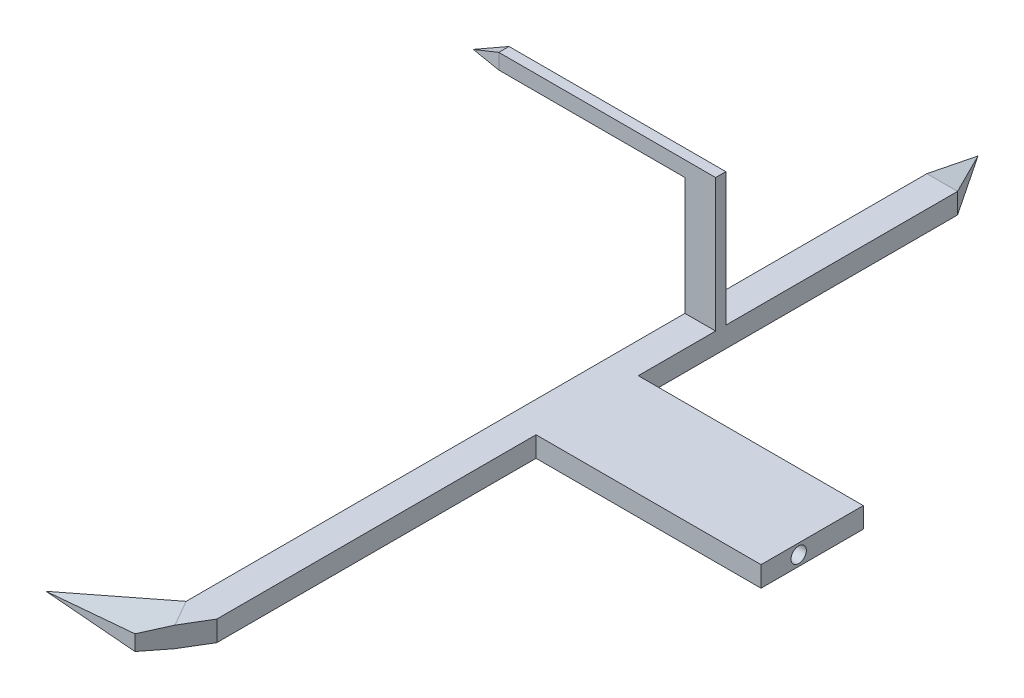
ISO-10303-21;
HEADER;
FILE_DESCRIPTION(('STEP AP214'),'2;1');
FILE_NAME('part.step','',(''),(''),'','','');
FILE_SCHEMA(('AUTOMOTIVE_DESIGN { 1 0 10303 214 1 1 1 1 }'));
ENDSEC;
DATA;
#1=APPLICATION_CONTEXT('core data for automotive mechanical design processes');
#2=APPLICATION_PROTOCOL_DEFINITION('international standard','automotive_design',2000,#1);
#3=PRODUCT_CONTEXT('',#1,'mechanical');
#4=PRODUCT('Part','Part','',(#3));
#5=PRODUCT_RELATED_PRODUCT_CATEGORY('part','',(#4));
#6=PRODUCT_DEFINITION_FORMATION('','',#4);
#7=PRODUCT_DEFINITION_CONTEXT('part definition',#1,'design');
#8=PRODUCT_DEFINITION('design','',#6,#7);
#9=PRODUCT_DEFINITION_SHAPE('','',#8);
#10=(LENGTH_UNIT() NAMED_UNIT(*) SI_UNIT(.MILLI.,.METRE.));
#11=(NAMED_UNIT(*) PLANE_ANGLE_UNIT() SI_UNIT($,.RADIAN.));
#12=(NAMED_UNIT(*) SI_UNIT($,.STERADIAN.) SOLID_ANGLE_UNIT());
#13=UNCERTAINTY_MEASURE_WITH_UNIT(LENGTH_MEASURE(1.E-05),#10,'distance_accuracy_value','');
#14=(GEOMETRIC_REPRESENTATION_CONTEXT(3) GLOBAL_UNCERTAINTY_ASSIGNED_CONTEXT((#13)) GLOBAL_UNIT_ASSIGNED_CONTEXT((#10,
#11,#12)) REPRESENTATION_CONTEXT('',''));
#15=CARTESIAN_POINT('',(0.,0.,0.));
#16=DIRECTION('',(0.,0.,1.));
#17=DIRECTION('',(1.,0.,0.));
#18=AXIS2_PLACEMENT_3D('',#15,#16,#17);
#19=CARTESIAN_POINT('',(7.62000000000002,5.08,0.));
#20=DIRECTION('',(-1.,0.,0.));
#21=DIRECTION('',(0.,0.,-1.));
#22=AXIS2_PLACEMENT_3D('',#19,#20,#21);
#23=PLANE('',#22);
#24=DIRECTION('',(0.,-1.,0.));
#25=VECTOR('',#24,1.);
#26=CARTESIAN_POINT('',(7.62000341419304,66.4618704376936,-12.7));
#27=LINE('',#26,#25);
#28=CARTESIAN_POINT('',(7.62000341419304,5.08,-12.7));
#29=VERTEX_POINT('',#28);
#30=CARTESIAN_POINT('',(7.62000341419304,0.,-12.7));
#31=VERTEX_POINT('',#30);
#32=EDGE_CURVE('E198',#29,#31,#27,.T.);
#33=ORIENTED_EDGE('',*,*,#32,.T.);
#34=DIRECTION('',(0.,0.,1.));
#35=VECTOR('',#34,1.);
#36=CARTESIAN_POINT('',(7.62000000000002,0.,0.));
#37=LINE('',#36,#35);
#38=CARTESIAN_POINT('',(7.62000600000002,0.,-91.9861));
#39=VERTEX_POINT('',#38);
#40=EDGE_CURVE('E302',#39,#31,#37,.T.);
#41=ORIENTED_EDGE('',*,*,#40,.F.);
#42=DIRECTION('',(0.,-1.,0.));
#43=VECTOR('',#42,1.);
#44=CARTESIAN_POINT('',(7.62000000000002,5.08,-91.9861));
#45=LINE('',#44,#43);
#46=CARTESIAN_POINT('',(7.62000000000002,5.08,-91.9861));
#47=VERTEX_POINT('',#46);
#48=EDGE_CURVE('E297',#47,#39,#45,.T.);
#49=ORIENTED_EDGE('',*,*,#48,.F.);
#50=DIRECTION('',(0.,0.,1.));
#51=VECTOR('',#50,1.);
#52=CARTESIAN_POINT('',(7.62000000000002,5.08,0.));
#53=LINE('',#52,#51);
#54=CARTESIAN_POINT('',(7.62000000000002,5.08,-34.4424));
#55=VERTEX_POINT('',#54);
#56=EDGE_CURVE('E293',#47,#55,#53,.T.);
#57=ORIENTED_EDGE('',*,*,#56,.T.);
#58=DIRECTION('',(0.,1.,0.));
#59=VECTOR('',#58,1.);
#60=CARTESIAN_POINT('',(7.62000000000002,0.,-34.4424));
#61=LINE('',#60,#59);
#62=CARTESIAN_POINT('',(7.62000000000002,38.1,-34.4424));
#63=VERTEX_POINT('',#62);
#64=EDGE_CURVE('E220',#55,#63,#61,.T.);
#65=ORIENTED_EDGE('',*,*,#64,.T.);
#66=DIRECTION('',(0.,0.,-1.));
#67=VECTOR('',#66,1.);
#68=CARTESIAN_POINT('',(7.62000000000002,38.1,-31.9024));
#69=LINE('',#68,#67);
#70=CARTESIAN_POINT('',(7.62000000000002,38.1,-31.9024));
#71=VERTEX_POINT('',#70);
#72=EDGE_CURVE('E232',#71,#63,#69,.T.);
#73=ORIENTED_EDGE('',*,*,#72,.F.);
#74=DIRECTION('',(0.,1.,0.));
#75=VECTOR('',#74,1.);
#76=CARTESIAN_POINT('',(7.62000000000002,0.,-31.9024));
#77=LINE('',#76,#75);
#78=CARTESIAN_POINT('',(7.62000000000002,5.08,-31.9024));
#79=VERTEX_POINT('',#78);
#80=EDGE_CURVE('E229',#79,#71,#77,.T.);
#81=ORIENTED_EDGE('',*,*,#80,.F.);
#82=EDGE_CURVE('E325',#79,#29,#53,.T.);
#83=ORIENTED_EDGE('',*,*,#82,.T.);
#84=EDGE_LOOP('',(#33,#41,#49,#57,#65,#73,#81,#83));
#85=FACE_BOUND('',#84,.T.);
#86=ADVANCED_FACE('F45',(#85),#23,.F.);
#87=CARTESIAN_POINT('',(0.,5.08,0.));
#88=DIRECTION('',(0.,1.,0.));
#89=DIRECTION('',(0.,0.,-1.));
#90=AXIS2_PLACEMENT_3D('',#87,#88,#89);
#91=PLANE('',#90);
#92=DIRECTION('',(0.,0.,-1.));
#93=VECTOR('',#92,1.);
#94=CARTESIAN_POINT('',(0.,5.08,0.));
#95=LINE('',#94,#93);
#96=CARTESIAN_POINT('',(0.,5.08,91.9861));
#97=VERTEX_POINT('',#96);
#98=CARTESIAN_POINT('',(0.,5.08,-31.9024));
#99=VERTEX_POINT('',#98);
#100=EDGE_CURVE('E294',#97,#99,#95,.T.);
#101=ORIENTED_EDGE('',*,*,#100,.F.);
#102=DIRECTION('',(-0.498283875853458,0.,-0.867013943985018));
#103=VECTOR('',#102,1.);
#104=CARTESIAN_POINT('',(-39.7397492303108,5.08,22.8389363392591));
#105=LINE('',#104,#103);
#106=CARTESIAN_POINT('',(3.72798434442267,5.08,98.4727927592955));
#107=VERTEX_POINT('',#106);
#108=EDGE_CURVE('E317',#107,#97,#105,.T.);
#109=ORIENTED_EDGE('',*,*,#108,.F.);
#110=DIRECTION('',(-0.514495755427529,0.,0.857492925712542));
#111=VECTOR('',#110,1.);
#112=CARTESIAN_POINT('',(46.1850441176472,5.08,27.7110264705885));
#113=LINE('',#112,#111);
#114=CARTESIAN_POINT('',(7.62000000000002,5.08,91.9861));
#115=VERTEX_POINT('',#114);
#116=EDGE_CURVE('E289',#115,#107,#113,.T.);
#117=ORIENTED_EDGE('',*,*,#116,.F.);
#118=CARTESIAN_POINT('',(7.62000341419304,5.08,12.7));
#119=VERTEX_POINT('',#118);
#120=EDGE_CURVE('E49',#119,#115,#53,.T.);
#121=ORIENTED_EDGE('',*,*,#120,.F.);
#122=DIRECTION('',(1.,0.,0.));
#123=VECTOR('',#122,1.);
#124=CARTESIAN_POINT('',(7.62000341419304,5.08,12.7));
#125=LINE('',#124,#123);
#126=CARTESIAN_POINT('',(63.5,5.08,12.7));
#127=VERTEX_POINT('',#126);
#128=EDGE_CURVE('E171',#119,#127,#125,.T.);
#129=ORIENTED_EDGE('',*,*,#128,.T.);
#130=DIRECTION('',(0.,0.,-1.));
#131=VECTOR('',#130,1.);
#132=CARTESIAN_POINT('',(63.5,5.08,-12.7));
#133=LINE('',#132,#131);
#134=CARTESIAN_POINT('',(63.5,5.08,-12.7));
#135=VERTEX_POINT('',#134);
#136=EDGE_CURVE('E178',#127,#135,#133,.T.);
#137=ORIENTED_EDGE('',*,*,#136,.T.);
#138=DIRECTION('',(-1.,0.,0.));
#139=VECTOR('',#138,1.);
#140=CARTESIAN_POINT('',(7.62000341419304,5.08,-12.7));
#141=LINE('',#140,#139);
#142=EDGE_CURVE('E197',#135,#29,#141,.T.);
#143=ORIENTED_EDGE('',*,*,#142,.T.);
#144=ORIENTED_EDGE('',*,*,#82,.F.);
#145=DIRECTION('',(1.,0.,0.));
#146=VECTOR('',#145,1.);
#147=CARTESIAN_POINT('',(0.,5.08,-31.9024));
#148=LINE('',#147,#146);
#149=EDGE_CURVE('E217',#99,#79,#148,.T.);
#150=ORIENTED_EDGE('',*,*,#149,.F.);
#151=EDGE_LOOP('',(#101,#109,#117,#121,#129,#137,#143,#144,#150));
#152=FACE_BOUND('',#151,.T.);
#153=ADVANCED_FACE('F187',(#152),#91,.T.);
#154=CARTESIAN_POINT('',(46.1850441176472,5.08,27.7110264705885));
#155=DIRECTION('',(-0.857492925712542,0.,-0.514495755427529));
#156=DIRECTION('',(0.51449575542753,0.,-0.857492925712543));
#157=AXIS2_PLACEMENT_3D('',#154,#155,#156);
#158=PLANE('',#157);
#159=DIRECTION('',(0.512558070553615,-0.0867074433253538,-0.854263450922686));
#160=VECTOR('',#159,1.);
#161=CARTESIAN_POINT('',(45.6400758618361,-7.09010453384916,28.6193068969404));
#162=LINE('',#161,#160);
#163=CARTESIAN_POINT('',(0.,0.630648525176283,104.6861));
#164=VERTEX_POINT('',#163);
#165=CARTESIAN_POINT('',(3.72798434442267,0.,98.4727927592955));
#166=VERTEX_POINT('',#165);
#167=EDGE_CURVE('E257',#164,#166,#162,.T.);
#168=ORIENTED_EDGE('',*,*,#167,.T.);
#169=DIRECTION('',(-0.514495755427529,0.,0.857492925712542));
#170=VECTOR('',#169,1.);
#171=CARTESIAN_POINT('',(46.1850441176472,0.,27.7110264705885));
#172=LINE('',#171,#170);
#173=CARTESIAN_POINT('',(7.62000000000002,0.,91.9861));
#174=VERTEX_POINT('',#173);
#175=EDGE_CURVE('E298',#174,#166,#172,.T.);
#176=ORIENTED_EDGE('',*,*,#175,.F.);
#177=DIRECTION('',(0.,-1.,0.));
#178=VECTOR('',#177,1.);
#179=CARTESIAN_POINT('',(7.62000000000002,5.08,91.9861));
#180=LINE('',#179,#178);
#181=EDGE_CURVE('E311',#115,#174,#180,.T.);
#182=ORIENTED_EDGE('',*,*,#181,.F.);
#183=ORIENTED_EDGE('',*,*,#116,.T.);
#184=DIRECTION('',(-0.512558070553615,-0.0867074433253538,0.854263450922686));
#185=VECTOR('',#184,1.);
#186=CARTESIAN_POINT('',(45.8658442690918,12.2082968919475,28.2430262181809));
#187=LINE('',#186,#185);
#188=CARTESIAN_POINT('',(0.,4.44935147482372,104.6861));
#189=VERTEX_POINT('',#188);
#190=EDGE_CURVE('E266',#107,#189,#187,.T.);
#191=ORIENTED_EDGE('',*,*,#190,.T.);
#192=DIRECTION('',(0.,-1.,0.));
#193=VECTOR('',#192,1.);
#194=CARTESIAN_POINT('',(0.,5.08,104.6861));
#195=LINE('',#194,#193);
#196=EDGE_CURVE('E308',#189,#164,#195,.T.);
#197=ORIENTED_EDGE('',*,*,#196,.T.);
#198=EDGE_LOOP('',(#168,#176,#182,#183,#191,#197));
#199=FACE_BOUND('',#198,.T.);
#200=ADVANCED_FACE('F356',(#199),#158,.F.);
#201=CARTESIAN_POINT('',(0.,5.08,104.6861));
#202=DIRECTION('',(0.,0.,-1.));
#203=DIRECTION('',(1.,0.,0.));
#204=AXIS2_PLACEMENT_3D('',#201,#202,#203);
#205=PLANE('',#204);
#206=DIRECTION('',(0.996287962103121,-0.0860830794547339,0.));
#207=VECTOR('',#206,1.);
#208=CARTESIAN_POINT('',(-0.38159211450458,0.663619539141816,104.6861));
#209=LINE('',#208,#207);
#210=CARTESIAN_POINT('',(-22.098,2.54,104.6861));
#211=VERTEX_POINT('',#210);
#212=EDGE_CURVE('E255',#211,#164,#209,.T.);
#213=ORIENTED_EDGE('',*,*,#212,.T.);
#214=ORIENTED_EDGE('',*,*,#196,.F.);
#215=DIRECTION('',(-0.996287962103121,-0.0860830794547339,0.));
#216=VECTOR('',#215,1.);
#217=CARTESIAN_POINT('',(0.0540866473671303,4.45402476742571,104.6861));
#218=LINE('',#217,#216);
#219=EDGE_CURVE('E263',#189,#211,#218,.T.);
#220=ORIENTED_EDGE('',*,*,#219,.T.);
#221=EDGE_LOOP('',(#213,#214,#220));
#222=FACE_BOUND('',#221,.T.);
#223=ADVANCED_FACE('F354',(#222),#205,.F.);
#224=CARTESIAN_POINT('',(39.7397492303108,5.08,69.1471636607409));
#225=DIRECTION('',(0.498283875853458,0.,0.867013943985018));
#226=DIRECTION('',(-0.867013943985018,0.,0.498283875853458));
#227=AXIS2_PLACEMENT_3D('',#224,#225,#226);
#228=PLANE('',#227);
#229=DIRECTION('',(-0.862740387088617,0.0991655617343237,0.495827808671618));
#230=VECTOR('',#229,1.);
#231=CARTESIAN_POINT('',(38.9143411348215,-4.47291277411741,69.621536129413));
#232=LINE('',#231,#230);
#233=CARTESIAN_POINT('',(0.,0.,91.9861));
#234=VERTEX_POINT('',#233);
#235=EDGE_CURVE('E252',#234,#211,#232,.T.);
#236=ORIENTED_EDGE('',*,*,#235,.T.);
#237=DIRECTION('',(0.862740387088617,0.0991655617343237,-0.495827808671618));
#238=VECTOR('',#237,1.);
#239=CARTESIAN_POINT('',(39.3489561412135,9.60286852197856,69.3717573901072));
#240=LINE('',#239,#238);
#241=EDGE_CURVE('E260',#211,#97,#240,.T.);
#242=ORIENTED_EDGE('',*,*,#241,.T.);
#243=DIRECTION('',(0.,-1.,0.));
#244=VECTOR('',#243,1.);
#245=CARTESIAN_POINT('',(0.,5.08,91.9861));
#246=LINE('',#245,#244);
#247=EDGE_CURVE('E305',#97,#234,#246,.T.);
#248=ORIENTED_EDGE('',*,*,#247,.T.);
#249=EDGE_LOOP('',(#236,#242,#248));
#250=FACE_BOUND('',#249,.T.);
#251=ADVANCED_FACE('F348',(#250),#228,.F.);
#252=CARTESIAN_POINT('',(0.,0.,0.));
#253=DIRECTION('',(0.,1.,0.));
#254=DIRECTION('',(0.,0.,-1.));
#255=AXIS2_PLACEMENT_3D('',#252,#253,#254);
#256=PLANE('',#255);
#257=DIRECTION('',(-0.498283875853458,0.,-0.867013943985018));
#258=VECTOR('',#257,1.);
#259=CARTESIAN_POINT('',(-39.7397492303108,0.,22.8389363392591));
#260=LINE('',#259,#258);
#261=EDGE_CURVE('E55',#166,#234,#260,.T.);
#262=ORIENTED_EDGE('',*,*,#261,.T.);
#263=DIRECTION('',(0.,0.,-1.));
#264=VECTOR('',#263,1.);
#265=CARTESIAN_POINT('',(0.,0.,0.));
#266=LINE('',#265,#264);
#267=CARTESIAN_POINT('',(0.,0.,-91.9861));
#268=VERTEX_POINT('',#267);
#269=EDGE_CURVE('E301',#234,#268,#266,.T.);
#270=ORIENTED_EDGE('',*,*,#269,.T.);
#271=DIRECTION('',(1.,0.,0.));
#272=VECTOR('',#271,1.);
#273=CARTESIAN_POINT('',(-22.098,0.,-91.9861));
#274=LINE('',#273,#272);
#275=EDGE_CURVE('E269',#268,#39,#274,.T.);
#276=ORIENTED_EDGE('',*,*,#275,.T.);
#277=ORIENTED_EDGE('',*,*,#40,.T.);
#278=DIRECTION('',(-1.,0.,0.));
#279=VECTOR('',#278,1.);
#280=CARTESIAN_POINT('',(7.62000341419304,0.,-12.7));
#281=LINE('',#280,#279);
#282=CARTESIAN_POINT('',(63.5,0.,-12.7));
#283=VERTEX_POINT('',#282);
#284=EDGE_CURVE('E190',#283,#31,#281,.T.);
#285=ORIENTED_EDGE('',*,*,#284,.F.);
#286=DIRECTION('',(0.,0.,-1.));
#287=VECTOR('',#286,1.);
#288=CARTESIAN_POINT('',(63.5,0.,-12.7));
#289=LINE('',#288,#287);
#290=CARTESIAN_POINT('',(63.5,0.,12.7));
#291=VERTEX_POINT('',#290);
#292=EDGE_CURVE('E192',#291,#283,#289,.T.);
#293=ORIENTED_EDGE('',*,*,#292,.F.);
#294=DIRECTION('',(1.,0.,0.));
#295=VECTOR('',#294,1.);
#296=CARTESIAN_POINT('',(7.62000341419304,0.,12.7));
#297=LINE('',#296,#295);
#298=CARTESIAN_POINT('',(7.62000170709653,0.,12.7));
#299=VERTEX_POINT('',#298);
#300=EDGE_CURVE('E174',#299,#291,#297,.T.);
#301=ORIENTED_EDGE('',*,*,#300,.F.);
#302=EDGE_CURVE('E288',#299,#174,#37,.T.);
#303=ORIENTED_EDGE('',*,*,#302,.T.);
#304=ORIENTED_EDGE('',*,*,#175,.T.);
#305=EDGE_LOOP('',(#262,#270,#276,#277,#285,#293,#301,#303,#304));
#306=FACE_BOUND('',#305,.T.);
#307=ADVANCED_FACE('F342',(#306),#256,.F.);
#308=DIRECTION('',(1.,0.,0.));
#309=VECTOR('',#308,1.);
#310=CARTESIAN_POINT('',(0.,5.08,-34.4424));
#311=LINE('',#310,#309);
#312=CARTESIAN_POINT('',(0.,5.08,-34.4424));
#313=VERTEX_POINT('',#312);
#314=EDGE_CURVE('E216',#313,#55,#311,.T.);
#315=ORIENTED_EDGE('',*,*,#314,.T.);
#316=ORIENTED_EDGE('',*,*,#56,.F.);
#317=DIRECTION('',(-1.,0.,0.));
#318=VECTOR('',#317,1.);
#319=CARTESIAN_POINT('',(0.,5.08,-91.9861));
#320=LINE('',#319,#318);
#321=CARTESIAN_POINT('',(0.,5.08,-91.9861));
#322=VERTEX_POINT('',#321);
#323=EDGE_CURVE('E314',#47,#322,#320,.T.);
#324=ORIENTED_EDGE('',*,*,#323,.T.);
#325=EDGE_CURVE('E292',#313,#322,#95,.T.);
#326=ORIENTED_EDGE('',*,*,#325,.F.);
#327=EDGE_LOOP('',(#315,#316,#324,#326));
#328=FACE_BOUND('',#327,.T.);
#329=ADVANCED_FACE('F376',(#328),#91,.T.);
#330=ORIENTED_EDGE('',*,*,#120,.T.);
#331=ORIENTED_EDGE('',*,*,#181,.T.);
#332=ORIENTED_EDGE('',*,*,#302,.F.);
#333=DIRECTION('',(0.,-1.,0.));
#334=VECTOR('',#333,1.);
#335=CARTESIAN_POINT('',(7.62000341419304,66.4618704376936,12.7));
#336=LINE('',#335,#334);
#337=EDGE_CURVE('E63',#119,#299,#336,.T.);
#338=ORIENTED_EDGE('',*,*,#337,.F.);
#339=EDGE_LOOP('',(#330,#331,#332,#338));
#340=FACE_BOUND('',#339,.T.);
#341=ADVANCED_FACE('F47',(#340),#23,.F.);
#342=CARTESIAN_POINT('',(0.,5.08,0.));
#343=DIRECTION('',(1.,0.,0.));
#344=DIRECTION('',(0.,0.,1.));
#345=AXIS2_PLACEMENT_3D('',#342,#343,#344);
#346=PLANE('',#345);
#347=CARTESIAN_POINT('',(0.,2.54,3.3401));
#348=DIRECTION('',(1.,0.,0.));
#349=DIRECTION('',(0.,0.,-1.));
#350=AXIS2_PLACEMENT_3D('',#347,#348,#349);
#351=CIRCLE('',#350,1.905);
#352=CARTESIAN_POINT('',(0.,2.54,1.4351));
#353=VERTEX_POINT('',#352);
#354=EDGE_CURVE('E417',#353,#353,#351,.T.);
#355=ORIENTED_EDGE('',*,*,#354,.T.);
#356=EDGE_LOOP('',(#355));
#357=FACE_BOUND('',#356,.T.);
#358=ORIENTED_EDGE('',*,*,#269,.F.);
#359=ORIENTED_EDGE('',*,*,#247,.F.);
#360=ORIENTED_EDGE('',*,*,#100,.T.);
#361=DIRECTION('',(0.,1.,0.));
#362=VECTOR('',#361,1.);
#363=CARTESIAN_POINT('',(0.,0.,-31.9024));
#364=LINE('',#363,#362);
#365=CARTESIAN_POINT('',(0.,34.29,-31.9024));
#366=VERTEX_POINT('',#365);
#367=EDGE_CURVE('E219',#99,#366,#364,.T.);
#368=ORIENTED_EDGE('',*,*,#367,.T.);
#369=DIRECTION('',(0.,0.,-1.));
#370=VECTOR('',#369,1.);
#371=CARTESIAN_POINT('',(0.,34.29,-31.9024));
#372=LINE('',#371,#370);
#373=CARTESIAN_POINT('',(0.,34.29,-34.4424));
#374=VERTEX_POINT('',#373);
#375=EDGE_CURVE('E249',#366,#374,#372,.T.);
#376=ORIENTED_EDGE('',*,*,#375,.T.);
#377=DIRECTION('',(0.,1.,0.));
#378=VECTOR('',#377,1.);
#379=CARTESIAN_POINT('',(0.,0.,-34.4424));
#380=LINE('',#379,#378);
#381=EDGE_CURVE('E234',#313,#374,#380,.T.);
#382=ORIENTED_EDGE('',*,*,#381,.F.);
#383=ORIENTED_EDGE('',*,*,#325,.T.);
#384=DIRECTION('',(0.,0.196116135138184,0.98058067569092));
#385=VECTOR('',#384,1.);
#386=CARTESIAN_POINT('',(0.,22.7696346153846,-3.53792692307693));
#387=LINE('',#386,#385);
#388=CARTESIAN_POINT('',(0.,2.54,-104.6861));
#389=VERTEX_POINT('',#388);
#390=EDGE_CURVE('E284',#389,#322,#387,.T.);
#391=ORIENTED_EDGE('',*,*,#390,.F.);
#392=DIRECTION('',(0.,0.196116135138184,-0.98058067569092));
#393=VECTOR('',#392,1.);
#394=CARTESIAN_POINT('',(0.,-17.49425,-4.51485000000001));
#395=LINE('',#394,#393);
#396=EDGE_CURVE('E276',#268,#389,#395,.T.);
#397=ORIENTED_EDGE('',*,*,#396,.F.);
#398=EDGE_LOOP('',(#358,#359,#360,#368,#376,#382,#383,#391,#397));
#399=FACE_BOUND('',#398,.T.);
#400=ADVANCED_FACE('F378',(#357,#399),#346,.F.);
#401=CARTESIAN_POINT('',(46.1850441176471,5.08,-27.7110264705882));
#402=DIRECTION('',(-0.857492925712544,0.,0.514495755427526));
#403=DIRECTION('',(-0.514495755427526,0.,-0.857492925712544));
#404=AXIS2_PLACEMENT_3D('',#401,#402,#403);
#405=PLANE('',#404);
#406=DIRECTION('',(-0.50709255283711,-0.169030850945703,-0.845154254728517));
#407=VECTOR('',#406,1.);
#408=CARTESIAN_POINT('',(45.0831857142857,17.5677285714286,-29.5474571428571));
#409=LINE('',#408,#407);
#410=EDGE_CURVE('E281',#47,#389,#409,.T.);
#411=ORIENTED_EDGE('',*,*,#410,.F.);
#412=ORIENTED_EDGE('',*,*,#48,.T.);
#413=DIRECTION('',(0.50709255283711,-0.169030850945703,0.845154254728517));
#414=VECTOR('',#413,1.);
#415=CARTESIAN_POINT('',(44.6477571428571,-12.3425857142857,-30.2731714285714));
#416=LINE('',#415,#414);
#417=EDGE_CURVE('E274',#389,#39,#416,.T.);
#418=ORIENTED_EDGE('',*,*,#417,.F.);
#419=EDGE_LOOP('',(#411,#412,#418));
#420=FACE_BOUND('',#419,.T.);
#421=ADVANCED_FACE('F384',(#420),#405,.F.);
#422=CARTESIAN_POINT('',(7.62001200000002,22.57425,-4.51485000000001));
#423=DIRECTION('',(0.,-0.98058067569092,0.196116135138184));
#424=DIRECTION('',(0.,0.196116135138184,0.98058067569092));
#425=AXIS2_PLACEMENT_3D('',#422,#423,#424);
#426=PLANE('',#425);
#427=ORIENTED_EDGE('',*,*,#410,.T.);
#428=ORIENTED_EDGE('',*,*,#390,.T.);
#429=ORIENTED_EDGE('',*,*,#323,.F.);
#430=EDGE_LOOP('',(#427,#428,#429));
#431=FACE_BOUND('',#430,.T.);
#432=ADVANCED_FACE('F367',(#431),#426,.F.);
#433=CARTESIAN_POINT('',(7.62001200000002,-17.6896346153846,-3.53792692307693));
#434=DIRECTION('',(0.,0.98058067569092,0.196116135138184));
#435=DIRECTION('',(0.,0.196116135138184,-0.98058067569092));
#436=AXIS2_PLACEMENT_3D('',#433,#434,#435);
#437=PLANE('',#436);
#438=ORIENTED_EDGE('',*,*,#275,.F.);
#439=ORIENTED_EDGE('',*,*,#396,.T.);
#440=ORIENTED_EDGE('',*,*,#417,.T.);
#441=EDGE_LOOP('',(#438,#439,#440));
#442=FACE_BOUND('',#441,.T.);
#443=ADVANCED_FACE('F359',(#442),#437,.F.);
#444=CARTESIAN_POINT('',(46.2929440248801,9.55291277411741,82.460305158115));
#445=DIRECTION('',(-0.0859779247867658,0.995070947905684,0.0494126004521642));
#446=DIRECTION('',(-0.996287962103121,-0.0860830794547339,0.));
#447=AXIS2_PLACEMENT_3D('',#444,#445,#446);
#448=PLANE('',#447);
#449=ORIENTED_EDGE('',*,*,#190,.F.);
#450=ORIENTED_EDGE('',*,*,#108,.T.);
#451=ORIENTED_EDGE('',*,*,#241,.F.);
#452=ORIENTED_EDGE('',*,*,#219,.F.);
#453=EDGE_LOOP('',(#449,#450,#451,#452));
#454=FACE_BOUND('',#453,.T.);
#455=ADVANCED_FACE('F357',(#454),#448,.T.);
#456=CARTESIAN_POINT('',(46.7275590312721,-4.52286852197856,82.2105264188092));
#457=DIRECTION('',(-0.0859779247867658,-0.995070947905684,0.0494126004521642));
#458=DIRECTION('',(0.996287962103121,-0.0860830794547339,0.));
#459=AXIS2_PLACEMENT_3D('',#456,#457,#458);
#460=PLANE('',#459);
#461=ORIENTED_EDGE('',*,*,#167,.F.);
#462=ORIENTED_EDGE('',*,*,#212,.F.);
#463=ORIENTED_EDGE('',*,*,#235,.F.);
#464=ORIENTED_EDGE('',*,*,#261,.F.);
#465=EDGE_LOOP('',(#461,#462,#463,#464));
#466=FACE_BOUND('',#465,.T.);
#467=ADVANCED_FACE('F351',(#466),#460,.T.);
#468=CARTESIAN_POINT('',(0.,34.29,-31.9024));
#469=DIRECTION('',(0.,1.,0.));
#470=DIRECTION('',(0.,0.,-1.));
#471=AXIS2_PLACEMENT_3D('',#468,#469,#470);
#472=PLANE('',#471);
#473=DIRECTION('',(0.986393923832144,0.,-0.164398987305357));
#474=VECTOR('',#473,1.);
#475=CARTESIAN_POINT('',(-6.83465945945946,34.29,-41.0079567567568));
#476=LINE('',#475,#474);
#477=CARTESIAN_POINT('',(-53.848,34.29,-33.1724));
#478=VERTEX_POINT('',#477);
#479=CARTESIAN_POINT('',(-46.228,34.29,-34.4424));
#480=VERTEX_POINT('',#479);
#481=EDGE_CURVE('E211',#478,#480,#476,.T.);
#482=ORIENTED_EDGE('',*,*,#481,.T.);
#483=DIRECTION('',(-1.,0.,0.));
#484=VECTOR('',#483,1.);
#485=CARTESIAN_POINT('',(0.,34.29,-34.4424));
#486=LINE('',#485,#484);
#487=EDGE_CURVE('E237',#374,#480,#486,.T.);
#488=ORIENTED_EDGE('',*,*,#487,.F.);
#489=ORIENTED_EDGE('',*,*,#375,.F.);
#490=DIRECTION('',(-1.,0.,0.));
#491=VECTOR('',#490,1.);
#492=CARTESIAN_POINT('',(0.,34.29,-31.9024));
#493=LINE('',#492,#491);
#494=CARTESIAN_POINT('',(-46.228,34.29,-31.9024));
#495=VERTEX_POINT('',#494);
#496=EDGE_CURVE('E223',#366,#495,#493,.T.);
#497=ORIENTED_EDGE('',*,*,#496,.T.);
#498=DIRECTION('',(-0.986393923832144,0.,-0.164398987305357));
#499=VECTOR('',#498,1.);
#500=CARTESIAN_POINT('',(3.92395675675675,34.29,-23.5437405405405));
#501=LINE('',#500,#499);
#502=EDGE_CURVE('E204',#495,#478,#501,.T.);
#503=ORIENTED_EDGE('',*,*,#502,.T.);
#504=EDGE_LOOP('',(#482,#488,#489,#497,#503));
#505=FACE_BOUND('',#504,.T.);
#506=ADVANCED_FACE('F365',(#505),#472,.F.);
#507=CARTESIAN_POINT('',(-24.4856,48.9712,-31.9024));
#508=DIRECTION('',(0.447213595499958,-0.894427190999916,0.));
#509=DIRECTION('',(0.894427190999916,0.447213595499958,0.));
#510=AXIS2_PLACEMENT_3D('',#507,#508,#509);
#511=PLANE('',#510);
#512=DIRECTION('',(0.,0.,-1.));
#513=VECTOR('',#512,1.);
#514=CARTESIAN_POINT('',(-46.228,38.1,-31.9024));
#515=LINE('',#514,#513);
#516=CARTESIAN_POINT('',(-46.228,38.1,-31.9024));
#517=VERTEX_POINT('',#516);
#518=CARTESIAN_POINT('',(-46.228,38.1,-34.4424));
#519=VERTEX_POINT('',#518);
#520=EDGE_CURVE('E246',#517,#519,#515,.T.);
#521=ORIENTED_EDGE('',*,*,#520,.T.);
#522=DIRECTION('',(0.884651736929383,0.442325868464691,-0.147441956154897));
#523=VECTOR('',#522,1.);
#524=CARTESIAN_POINT('',(-25.2895652173913,48.5692173913044,-37.9321391304348));
#525=LINE('',#524,#523);
#526=EDGE_CURVE('E214',#478,#519,#525,.T.);
#527=ORIENTED_EDGE('',*,*,#526,.F.);
#528=DIRECTION('',(-0.884651736929383,-0.442325868464691,-0.147441956154897));
#529=VECTOR('',#528,1.);
#530=CARTESIAN_POINT('',(-24.9582608695652,48.7348695652174,-28.3574434782609));
#531=LINE('',#530,#529);
#532=EDGE_CURVE('E209',#517,#478,#531,.T.);
#533=ORIENTED_EDGE('',*,*,#532,.F.);
#534=EDGE_LOOP('',(#521,#527,#533));
#535=FACE_BOUND('',#534,.T.);
#536=ADVANCED_FACE('F450',(#535),#511,.F.);
#537=CARTESIAN_POINT('',(0.,38.1,-31.9024));
#538=DIRECTION('',(0.,1.,0.));
#539=DIRECTION('',(0.,0.,-1.));
#540=AXIS2_PLACEMENT_3D('',#537,#538,#539);
#541=PLANE('',#540);
#542=DIRECTION('',(-1.,0.,0.));
#543=VECTOR('',#542,1.);
#544=CARTESIAN_POINT('',(0.,38.1,-34.4424));
#545=LINE('',#544,#543);
#546=EDGE_CURVE('E239',#63,#519,#545,.T.);
#547=ORIENTED_EDGE('',*,*,#546,.T.);
#548=ORIENTED_EDGE('',*,*,#520,.F.);
#549=DIRECTION('',(-1.,0.,0.));
#550=VECTOR('',#549,1.);
#551=CARTESIAN_POINT('',(0.,38.1,-31.9024));
#552=LINE('',#551,#550);
#553=EDGE_CURVE('E226',#71,#517,#552,.T.);
#554=ORIENTED_EDGE('',*,*,#553,.F.);
#555=ORIENTED_EDGE('',*,*,#72,.T.);
#556=EDGE_LOOP('',(#547,#548,#554,#555));
#557=FACE_BOUND('',#556,.T.);
#558=ADVANCED_FACE('F445',(#557),#541,.T.);
#559=CARTESIAN_POINT('',(0.,0.,-31.9024));
#560=DIRECTION('',(0.,0.,1.));
#561=DIRECTION('',(-1.,0.,0.));
#562=AXIS2_PLACEMENT_3D('',#559,#560,#561);
#563=PLANE('',#562);
#564=DIRECTION('',(0.,-1.,0.));
#565=VECTOR('',#564,1.);
#566=CARTESIAN_POINT('',(-46.228,49.022,-31.9024));
#567=LINE('',#566,#565);
#568=EDGE_CURVE('E207',#517,#495,#567,.T.);
#569=ORIENTED_EDGE('',*,*,#568,.T.);
#570=ORIENTED_EDGE('',*,*,#496,.F.);
#571=ORIENTED_EDGE('',*,*,#367,.F.);
#572=ORIENTED_EDGE('',*,*,#149,.T.);
#573=ORIENTED_EDGE('',*,*,#80,.T.);
#574=ORIENTED_EDGE('',*,*,#553,.T.);
#575=EDGE_LOOP('',(#569,#570,#571,#572,#573,#574));
#576=FACE_BOUND('',#575,.T.);
#577=ADVANCED_FACE('F392',(#576),#563,.T.);
#578=CARTESIAN_POINT('',(0.,0.,-34.4424));
#579=DIRECTION('',(0.,0.,1.));
#580=DIRECTION('',(-1.,0.,0.));
#581=AXIS2_PLACEMENT_3D('',#578,#579,#580);
#582=PLANE('',#581);
#583=ORIENTED_EDGE('',*,*,#546,.F.);
#584=ORIENTED_EDGE('',*,*,#64,.F.);
#585=ORIENTED_EDGE('',*,*,#314,.F.);
#586=ORIENTED_EDGE('',*,*,#381,.T.);
#587=ORIENTED_EDGE('',*,*,#487,.T.);
#588=DIRECTION('',(0.,-1.,0.));
#589=VECTOR('',#588,1.);
#590=CARTESIAN_POINT('',(-46.228,0.,-34.4424));
#591=LINE('',#590,#589);
#592=EDGE_CURVE('E11',#519,#480,#591,.T.);
#593=ORIENTED_EDGE('',*,*,#592,.F.);
#594=EDGE_LOOP('',(#583,#584,#585,#586,#587,#593));
#595=FACE_BOUND('',#594,.T.);
#596=ADVANCED_FACE('F397',(#595),#582,.F.);
#597=CARTESIAN_POINT('',(-6.83465945945946,49.022,-41.0079567567568));
#598=DIRECTION('',(0.164398987305357,0.,0.986393923832144));
#599=DIRECTION('',(-0.986393923832144,0.,0.164398987305357));
#600=AXIS2_PLACEMENT_3D('',#597,#598,#599);
#601=PLANE('',#600);
#602=ORIENTED_EDGE('',*,*,#481,.F.);
#603=ORIENTED_EDGE('',*,*,#526,.T.);
#604=ORIENTED_EDGE('',*,*,#592,.T.);
#605=EDGE_LOOP('',(#602,#603,#604));
#606=FACE_BOUND('',#605,.T.);
#607=ADVANCED_FACE('F439',(#606),#601,.F.);
#608=CARTESIAN_POINT('',(3.92395675675675,49.022,-23.5437405405405));
#609=DIRECTION('',(0.164398987305357,0.,-0.986393923832144));
#610=DIRECTION('',(0.986393923832144,0.,0.164398987305357));
#611=AXIS2_PLACEMENT_3D('',#608,#609,#610);
#612=PLANE('',#611);
#613=ORIENTED_EDGE('',*,*,#568,.F.);
#614=ORIENTED_EDGE('',*,*,#532,.T.);
#615=ORIENTED_EDGE('',*,*,#502,.F.);
#616=EDGE_LOOP('',(#613,#614,#615));
#617=FACE_BOUND('',#616,.T.);
#618=ADVANCED_FACE('F433',(#617),#612,.F.);
#619=CARTESIAN_POINT('',(7.62000341419304,66.4618704376936,12.7));
#620=DIRECTION('',(0.,0.,1.));
#621=DIRECTION('',(-1.,0.,0.));
#622=AXIS2_PLACEMENT_3D('',#619,#620,#621);
#623=PLANE('',#622);
#624=ORIENTED_EDGE('',*,*,#337,.T.);
#625=ORIENTED_EDGE('',*,*,#300,.T.);
#626=DIRECTION('',(0.,-1.,0.));
#627=VECTOR('',#626,1.);
#628=CARTESIAN_POINT('',(63.5,66.4618704376936,12.7));
#629=LINE('',#628,#627);
#630=EDGE_CURVE('E167',#127,#291,#629,.T.);
#631=ORIENTED_EDGE('',*,*,#630,.F.);
#632=ORIENTED_EDGE('',*,*,#128,.F.);
#633=EDGE_LOOP('',(#624,#625,#631,#632));
#634=FACE_BOUND('',#633,.T.);
#635=ADVANCED_FACE('F169',(#634),#623,.T.);
#636=CARTESIAN_POINT('',(63.5,66.4618704376936,-12.7));
#637=DIRECTION('',(1.,0.,0.));
#638=DIRECTION('',(0.,0.,1.));
#639=AXIS2_PLACEMENT_3D('',#636,#637,#638);
#640=PLANE('',#639);
#641=CARTESIAN_POINT('',(63.5,2.54,3.34010000000002));
#642=DIRECTION('',(1.,0.,0.));
#643=DIRECTION('',(0.,0.,-1.));
#644=AXIS2_PLACEMENT_3D('',#641,#642,#643);
#645=CIRCLE('',#644,1.905);
#646=CARTESIAN_POINT('',(63.5,2.54,1.43510000000002));
#647=VERTEX_POINT('',#646);
#648=EDGE_CURVE('E415',#647,#647,#645,.T.);
#649=ORIENTED_EDGE('',*,*,#648,.F.);
#650=EDGE_LOOP('',(#649));
#651=FACE_BOUND('',#650,.T.);
#652=ORIENTED_EDGE('',*,*,#630,.T.);
#653=ORIENTED_EDGE('',*,*,#292,.T.);
#654=DIRECTION('',(0.,-1.,0.));
#655=VECTOR('',#654,1.);
#656=CARTESIAN_POINT('',(63.5,66.4618704376936,-12.7));
#657=LINE('',#656,#655);
#658=EDGE_CURVE('E182',#135,#283,#657,.T.);
#659=ORIENTED_EDGE('',*,*,#658,.F.);
#660=ORIENTED_EDGE('',*,*,#136,.F.);
#661=EDGE_LOOP('',(#652,#653,#659,#660));
#662=FACE_BOUND('',#661,.T.);
#663=ADVANCED_FACE('F181',(#651,#662),#640,.T.);
#664=CARTESIAN_POINT('',(7.62000341419304,66.4618704376936,-12.7));
#665=DIRECTION('',(0.,0.,-1.));
#666=DIRECTION('',(1.,0.,0.));
#667=AXIS2_PLACEMENT_3D('',#664,#665,#666);
#668=PLANE('',#667);
#669=ORIENTED_EDGE('',*,*,#658,.T.);
#670=ORIENTED_EDGE('',*,*,#284,.T.);
#671=ORIENTED_EDGE('',*,*,#32,.F.);
#672=ORIENTED_EDGE('',*,*,#142,.F.);
#673=EDGE_LOOP('',(#669,#670,#671,#672));
#674=FACE_BOUND('',#673,.T.);
#675=ADVANCED_FACE('F414',(#674),#668,.T.);
#676=CARTESIAN_POINT('',(63.5,2.54,3.34010000000002));
#677=DIRECTION('',(-1.,0.,0.));
#678=DIRECTION('',(0.,0.,-1.));
#679=AXIS2_PLACEMENT_3D('',#676,#677,#678);
#680=CYLINDRICAL_SURFACE('',#679,1.905);
#681=ORIENTED_EDGE('',*,*,#648,.T.);
#682=EDGE_LOOP('',(#681));
#683=FACE_BOUND('',#682,.T.);
#684=ORIENTED_EDGE('',*,*,#354,.F.);
#685=EDGE_LOOP('',(#684));
#686=FACE_BOUND('',#685,.T.);
#687=ADVANCED_FACE('F423',(#683,#686),#680,.F.);
#688=CLOSED_SHELL('',(#86,#153,#200,#223,#251,#307,#329,#341,#400,#421,#432,#443,#455,#467,#506,
#536,#558,#577,#596,#607,#618,#635,#663,#675,#687));
#689=MANIFOLD_SOLID_BREP('B2',#688);
#690=ADVANCED_BREP_SHAPE_REPRESENTATION('',(#18,#689),#14);
#691=SHAPE_DEFINITION_REPRESENTATION(#9,#690);
ENDSEC;
END-ISO-10303-21;
